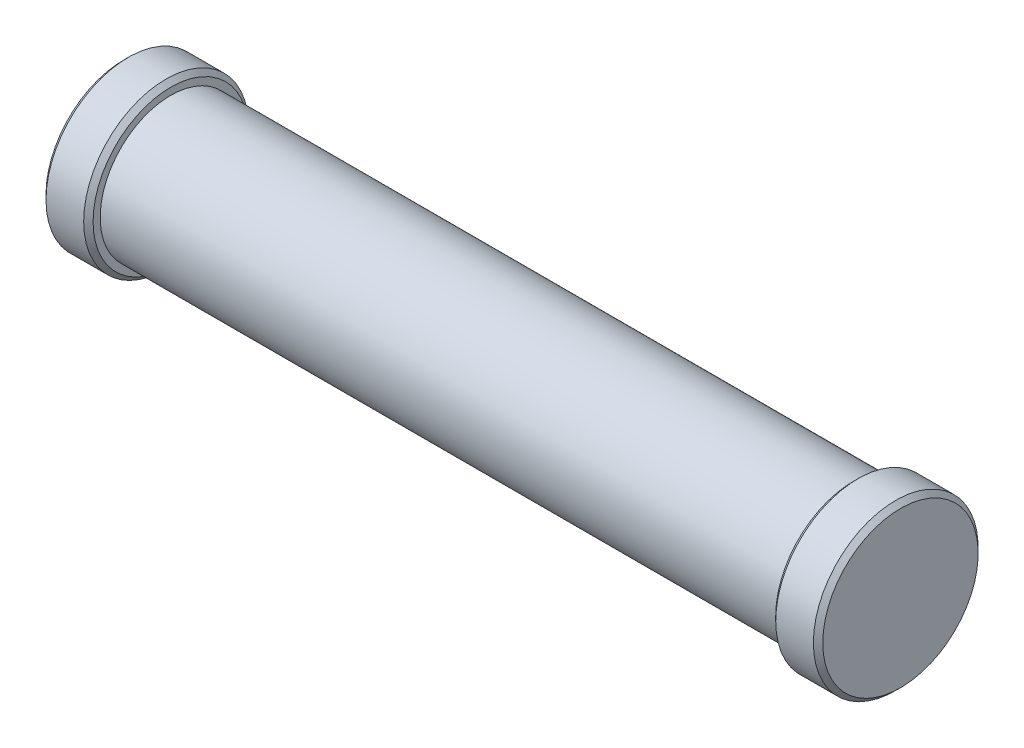
ISO-10303-21;
HEADER;
FILE_DESCRIPTION(('STEP AP214'),'2;1');
FILE_NAME('part.step','',(''),(''),'','','');
FILE_SCHEMA(('AUTOMOTIVE_DESIGN { 1 0 10303 214 1 1 1 1 }'));
ENDSEC;
DATA;
#1=APPLICATION_CONTEXT('core data for automotive mechanical design processes');
#2=APPLICATION_PROTOCOL_DEFINITION('international standard','automotive_design',2000,#1);
#3=PRODUCT_CONTEXT('',#1,'mechanical');
#4=PRODUCT('Part','Part','',(#3));
#5=PRODUCT_RELATED_PRODUCT_CATEGORY('part','',(#4));
#6=PRODUCT_DEFINITION_FORMATION('','',#4);
#7=PRODUCT_DEFINITION_CONTEXT('part definition',#1,'design');
#8=PRODUCT_DEFINITION('design','',#6,#7);
#9=PRODUCT_DEFINITION_SHAPE('','',#8);
#10=(LENGTH_UNIT() NAMED_UNIT(*) SI_UNIT(.MILLI.,.METRE.));
#11=(NAMED_UNIT(*) PLANE_ANGLE_UNIT() SI_UNIT($,.RADIAN.));
#12=(NAMED_UNIT(*) SI_UNIT($,.STERADIAN.) SOLID_ANGLE_UNIT());
#13=UNCERTAINTY_MEASURE_WITH_UNIT(LENGTH_MEASURE(1.E-05),#10,'distance_accuracy_value','');
#14=(GEOMETRIC_REPRESENTATION_CONTEXT(3) GLOBAL_UNCERTAINTY_ASSIGNED_CONTEXT((#13)) GLOBAL_UNIT_ASSIGNED_CONTEXT((#10,
#11,#12)) REPRESENTATION_CONTEXT('',''));
#15=CARTESIAN_POINT('',(0.,0.,0.));
#16=DIRECTION('',(0.,0.,1.));
#17=DIRECTION('',(1.,0.,0.));
#18=AXIS2_PLACEMENT_3D('',#15,#16,#17);
#19=CARTESIAN_POINT('',(165.,0.,0.));
#20=DIRECTION('',(-1.,0.,0.));
#21=DIRECTION('',(0.,0.,-1.));
#22=AXIS2_PLACEMENT_3D('',#19,#20,#21);
#23=CYLINDRICAL_SURFACE('',#22,35.);
#24=CARTESIAN_POINT('',(147.,0.,0.));
#25=DIRECTION('',(-1.,0.,0.));
#26=DIRECTION('',(0.,0.,1.));
#27=AXIS2_PLACEMENT_3D('',#24,#25,#26);
#28=CIRCLE('',#27,35.);
#29=CARTESIAN_POINT('',(147.,0.,35.));
#30=VERTEX_POINT('',#29);
#31=EDGE_CURVE('E55',#30,#30,#28,.T.);
#32=ORIENTED_EDGE('',*,*,#31,.F.);
#33=EDGE_LOOP('',(#32));
#34=FACE_BOUND('',#33,.T.);
#35=CARTESIAN_POINT('',(163.,0.,0.));
#36=DIRECTION('',(-1.,0.,0.));
#37=DIRECTION('',(0.,0.,1.));
#38=AXIS2_PLACEMENT_3D('',#35,#36,#37);
#39=CIRCLE('',#38,35.);
#40=CARTESIAN_POINT('',(163.,0.,35.));
#41=VERTEX_POINT('',#40);
#42=EDGE_CURVE('E59',#41,#41,#39,.F.);
#43=ORIENTED_EDGE('',*,*,#42,.F.);
#44=EDGE_LOOP('',(#43));
#45=FACE_BOUND('',#44,.T.);
#46=ADVANCED_FACE('F44',(#34,#45),#23,.T.);
#47=CARTESIAN_POINT('',(165.,0.,0.));
#48=DIRECTION('',(1.,0.,0.));
#49=DIRECTION('',(0.,0.,1.));
#50=AXIS2_PLACEMENT_3D('',#47,#48,#49);
#51=PLANE('',#50);
#52=CARTESIAN_POINT('',(165.,0.,0.));
#53=DIRECTION('',(-1.,0.,0.));
#54=DIRECTION('',(0.,0.,1.));
#55=AXIS2_PLACEMENT_3D('',#52,#53,#54);
#56=CIRCLE('',#55,32.9999999999999);
#57=CARTESIAN_POINT('',(165.,0.,32.9999999999999));
#58=VERTEX_POINT('',#57);
#59=EDGE_CURVE('E11',#58,#58,#56,.T.);
#60=ORIENTED_EDGE('',*,*,#59,.F.);
#61=EDGE_LOOP('',(#60));
#62=FACE_BOUND('',#61,.T.);
#63=ADVANCED_FACE('F67',(#62),#51,.T.);
#64=CARTESIAN_POINT('',(145.,0.,0.));
#65=DIRECTION('',(1.,0.,0.));
#66=DIRECTION('',(0.,0.,1.));
#67=AXIS2_PLACEMENT_3D('',#64,#65,#66);
#68=PLANE('',#67);
#69=CARTESIAN_POINT('',(145.,0.,0.));
#70=DIRECTION('',(-1.,0.,0.));
#71=DIRECTION('',(0.,0.,1.));
#72=AXIS2_PLACEMENT_3D('',#69,#70,#71);
#73=CIRCLE('',#72,33.);
#74=CARTESIAN_POINT('',(145.,0.,33.));
#75=VERTEX_POINT('',#74);
#76=EDGE_CURVE('E51',#75,#75,#73,.F.);
#77=ORIENTED_EDGE('',*,*,#76,.F.);
#78=EDGE_LOOP('',(#77));
#79=FACE_BOUND('',#78,.T.);
#80=ADVANCED_FACE('F73',(#79),#68,.F.);
#81=CARTESIAN_POINT('',(147.,0.,0.));
#82=DIRECTION('',(1.,0.,0.));
#83=DIRECTION('',(0.,0.,1.));
#84=AXIS2_PLACEMENT_3D('',#81,#82,#83);
#85=CONICAL_SURFACE('',#84,35.,0.785398163397448);
#86=ORIENTED_EDGE('',*,*,#76,.T.);
#87=EDGE_LOOP('',(#86));
#88=FACE_BOUND('',#87,.T.);
#89=ORIENTED_EDGE('',*,*,#31,.T.);
#90=EDGE_LOOP('',(#89));
#91=FACE_BOUND('',#90,.T.);
#92=ADVANCED_FACE('F78',(#88,#91),#85,.T.);
#93=CARTESIAN_POINT('',(165.,0.,0.));
#94=DIRECTION('',(-1.,0.,0.));
#95=DIRECTION('',(0.,0.,-1.));
#96=AXIS2_PLACEMENT_3D('',#93,#94,#95);
#97=CONICAL_SURFACE('',#96,32.9999999999999,0.785398163397447);
#98=ORIENTED_EDGE('',*,*,#42,.T.);
#99=EDGE_LOOP('',(#98));
#100=FACE_BOUND('',#99,.T.);
#101=ORIENTED_EDGE('',*,*,#59,.T.);
#102=EDGE_LOOP('',(#101));
#103=FACE_BOUND('',#102,.T.);
#104=ADVANCED_FACE('F46',(#100,#103),#97,.T.);
#105=CLOSED_SHELL('',(#46,#63,#80,#92,#104));
#106=MANIFOLD_SOLID_BREP('B2',#105);
#107=CARTESIAN_POINT('',(-165.,0.,0.));
#108=DIRECTION('',(1.,0.,0.));
#109=DIRECTION('',(0.,0.,-1.));
#110=AXIS2_PLACEMENT_3D('',#107,#108,#109);
#111=CYLINDRICAL_SURFACE('',#110,35.);
#112=CARTESIAN_POINT('',(-147.,0.,0.));
#113=DIRECTION('',(-1.,0.,0.));
#114=DIRECTION('',(0.,0.,1.));
#115=AXIS2_PLACEMENT_3D('',#112,#113,#114);
#116=CIRCLE('',#115,35.);
#117=CARTESIAN_POINT('',(-147.,0.,35.));
#118=VERTEX_POINT('',#117);
#119=EDGE_CURVE('E133',#118,#118,#116,.T.);
#120=ORIENTED_EDGE('',*,*,#119,.T.);
#121=EDGE_LOOP('',(#120));
#122=FACE_BOUND('',#121,.T.);
#123=CARTESIAN_POINT('',(-163.,0.,0.));
#124=DIRECTION('',(-1.,0.,0.));
#125=DIRECTION('',(0.,0.,1.));
#126=AXIS2_PLACEMENT_3D('',#123,#124,#125);
#127=CIRCLE('',#126,35.);
#128=CARTESIAN_POINT('',(-163.,0.,35.));
#129=VERTEX_POINT('',#128);
#130=EDGE_CURVE('E137',#129,#129,#127,.F.);
#131=ORIENTED_EDGE('',*,*,#130,.T.);
#132=EDGE_LOOP('',(#131));
#133=FACE_BOUND('',#132,.T.);
#134=ADVANCED_FACE('F122',(#122,#133),#111,.T.);
#135=CARTESIAN_POINT('',(-165.,0.,0.));
#136=DIRECTION('',(-1.,0.,0.));
#137=DIRECTION('',(0.,0.,1.));
#138=AXIS2_PLACEMENT_3D('',#135,#136,#137);
#139=PLANE('',#138);
#140=CARTESIAN_POINT('',(-165.,0.,0.));
#141=DIRECTION('',(-1.,0.,0.));
#142=DIRECTION('',(0.,0.,1.));
#143=AXIS2_PLACEMENT_3D('',#140,#141,#142);
#144=CIRCLE('',#143,32.9999999999999);
#145=CARTESIAN_POINT('',(-165.,0.,32.9999999999999));
#146=VERTEX_POINT('',#145);
#147=EDGE_CURVE('E43',#146,#146,#144,.T.);
#148=ORIENTED_EDGE('',*,*,#147,.T.);
#149=EDGE_LOOP('',(#148));
#150=FACE_BOUND('',#149,.T.);
#151=ADVANCED_FACE('F153',(#150),#139,.T.);
#152=CARTESIAN_POINT('',(-145.,0.,0.));
#153=DIRECTION('',(-1.,0.,0.));
#154=DIRECTION('',(0.,0.,1.));
#155=AXIS2_PLACEMENT_3D('',#152,#153,#154);
#156=PLANE('',#155);
#157=CARTESIAN_POINT('',(-145.,0.,0.));
#158=DIRECTION('',(-1.,0.,0.));
#159=DIRECTION('',(0.,0.,1.));
#160=AXIS2_PLACEMENT_3D('',#157,#158,#159);
#161=CIRCLE('',#160,33.);
#162=CARTESIAN_POINT('',(-145.,0.,33.));
#163=VERTEX_POINT('',#162);
#164=EDGE_CURVE('E129',#163,#163,#161,.F.);
#165=ORIENTED_EDGE('',*,*,#164,.T.);
#166=EDGE_LOOP('',(#165));
#167=FACE_BOUND('',#166,.T.);
#168=ADVANCED_FACE('F150',(#167),#156,.F.);
#169=CARTESIAN_POINT('',(-147.,0.,0.));
#170=DIRECTION('',(-1.,0.,0.));
#171=DIRECTION('',(0.,0.,1.));
#172=AXIS2_PLACEMENT_3D('',#169,#170,#171);
#173=CONICAL_SURFACE('',#172,35.,0.785398163397448);
#174=ORIENTED_EDGE('',*,*,#164,.F.);
#175=EDGE_LOOP('',(#174));
#176=FACE_BOUND('',#175,.T.);
#177=ORIENTED_EDGE('',*,*,#119,.F.);
#178=EDGE_LOOP('',(#177));
#179=FACE_BOUND('',#178,.T.);
#180=ADVANCED_FACE('F146',(#176,#179),#173,.T.);
#181=CARTESIAN_POINT('',(-165.,0.,0.));
#182=DIRECTION('',(1.,0.,0.));
#183=DIRECTION('',(0.,0.,-1.));
#184=AXIS2_PLACEMENT_3D('',#181,#182,#183);
#185=CONICAL_SURFACE('',#184,32.9999999999999,0.785398163397447);
#186=ORIENTED_EDGE('',*,*,#130,.F.);
#187=EDGE_LOOP('',(#186));
#188=FACE_BOUND('',#187,.T.);
#189=ORIENTED_EDGE('',*,*,#147,.F.);
#190=EDGE_LOOP('',(#189));
#191=FACE_BOUND('',#190,.T.);
#192=ADVANCED_FACE('F124',(#188,#191),#185,.T.);
#193=CLOSED_SHELL('',(#134,#151,#168,#180,#192));
#194=MANIFOLD_SOLID_BREP('B6',#193);
#195=CARTESIAN_POINT('',(145.,0.,0.));
#196=DIRECTION('',(-1.,0.,0.));
#197=DIRECTION('',(0.,0.,1.));
#198=AXIS2_PLACEMENT_3D('',#195,#196,#197);
#199=CYLINDRICAL_SURFACE('',#198,30.);
#200=CARTESIAN_POINT('',(145.,0.,0.));
#201=DIRECTION('',(1.,0.,0.));
#202=DIRECTION('',(0.,0.,-1.));
#203=AXIS2_PLACEMENT_3D('',#200,#201,#202);
#204=CIRCLE('',#203,30.);
#205=CARTESIAN_POINT('',(145.,0.,-30.));
#206=VERTEX_POINT('',#205);
#207=EDGE_CURVE('E121',#206,#206,#204,.T.);
#208=ORIENTED_EDGE('',*,*,#207,.F.);
#209=EDGE_LOOP('',(#208));
#210=FACE_BOUND('',#209,.T.);
#211=CARTESIAN_POINT('',(-145.,0.,0.));
#212=DIRECTION('',(1.,0.,0.));
#213=DIRECTION('',(0.,0.,-1.));
#214=AXIS2_PLACEMENT_3D('',#211,#212,#213);
#215=CIRCLE('',#214,30.);
#216=CARTESIAN_POINT('',(-145.,0.,-30.));
#217=VERTEX_POINT('',#216);
#218=EDGE_CURVE('E195',#217,#217,#215,.T.);
#219=ORIENTED_EDGE('',*,*,#218,.T.);
#220=EDGE_LOOP('',(#219));
#221=FACE_BOUND('',#220,.T.);
#222=ADVANCED_FACE('F192',(#210,#221),#199,.T.);
#223=CARTESIAN_POINT('',(145.,0.,0.));
#224=DIRECTION('',(1.,0.,0.));
#225=DIRECTION('',(0.,0.,-1.));
#226=AXIS2_PLACEMENT_3D('',#223,#224,#225);
#227=PLANE('',#226);
#228=ORIENTED_EDGE('',*,*,#207,.T.);
#229=EDGE_LOOP('',(#228));
#230=FACE_BOUND('',#229,.T.);
#231=ADVANCED_FACE('F207',(#230),#227,.T.);
#232=CARTESIAN_POINT('',(-145.,0.,0.));
#233=DIRECTION('',(1.,0.,0.));
#234=DIRECTION('',(0.,0.,-1.));
#235=AXIS2_PLACEMENT_3D('',#232,#233,#234);
#236=PLANE('',#235);
#237=ORIENTED_EDGE('',*,*,#218,.F.);
#238=EDGE_LOOP('',(#237));
#239=FACE_BOUND('',#238,.T.);
#240=ADVANCED_FACE('F205',(#239),#236,.F.);
#241=CLOSED_SHELL('',(#222,#231,#240));
#242=MANIFOLD_SOLID_BREP('B38',#241);
#243=ADVANCED_BREP_SHAPE_REPRESENTATION('',(#18,#106,#194,#242),#14);
#244=SHAPE_DEFINITION_REPRESENTATION(#9,#243);
ENDSEC;
END-ISO-10303-21;
